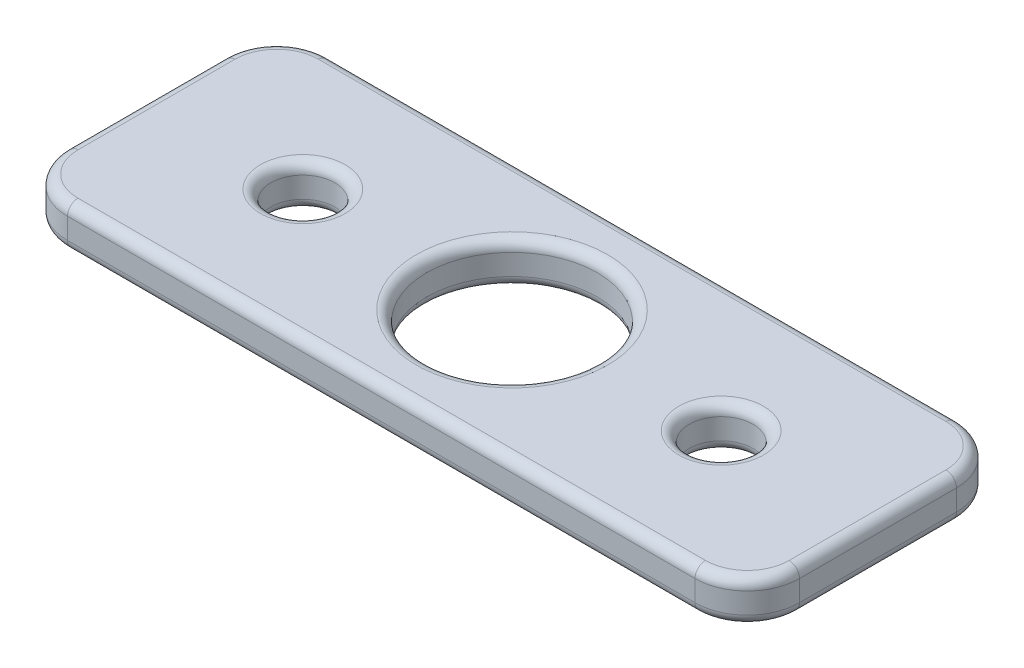
ISO-10303-21;
HEADER;
FILE_DESCRIPTION(('STEP AP214'),'2;1');
FILE_NAME('part.step','',(''),(''),'','','');
FILE_SCHEMA(('AUTOMOTIVE_DESIGN { 1 0 10303 214 1 1 1 1 }'));
ENDSEC;
DATA;
#1=APPLICATION_CONTEXT('core data for automotive mechanical design processes');
#2=APPLICATION_PROTOCOL_DEFINITION('international standard','automotive_design',2000,#1);
#3=PRODUCT_CONTEXT('',#1,'mechanical');
#4=PRODUCT('Part','Part','',(#3));
#5=PRODUCT_RELATED_PRODUCT_CATEGORY('part','',(#4));
#6=PRODUCT_DEFINITION_FORMATION('','',#4);
#7=PRODUCT_DEFINITION_CONTEXT('part definition',#1,'design');
#8=PRODUCT_DEFINITION('design','',#6,#7);
#9=PRODUCT_DEFINITION_SHAPE('','',#8);
#10=(LENGTH_UNIT() NAMED_UNIT(*) SI_UNIT(.MILLI.,.METRE.));
#11=(NAMED_UNIT(*) PLANE_ANGLE_UNIT() SI_UNIT($,.RADIAN.));
#12=(NAMED_UNIT(*) SI_UNIT($,.STERADIAN.) SOLID_ANGLE_UNIT());
#13=UNCERTAINTY_MEASURE_WITH_UNIT(LENGTH_MEASURE(1.E-05),#10,'distance_accuracy_value','');
#14=(GEOMETRIC_REPRESENTATION_CONTEXT(3) GLOBAL_UNCERTAINTY_ASSIGNED_CONTEXT((#13)) GLOBAL_UNIT_ASSIGNED_CONTEXT((#10,
#11,#12)) REPRESENTATION_CONTEXT('',''));
#15=CARTESIAN_POINT('',(0.,0.,0.));
#16=DIRECTION('',(0.,0.,1.));
#17=DIRECTION('',(1.,0.,0.));
#18=AXIS2_PLACEMENT_3D('',#15,#16,#17);
#19=CARTESIAN_POINT('',(0.,4.,0.));
#20=DIRECTION('',(0.,-1.,0.));
#21=DIRECTION('',(0.,0.,-1.));
#22=AXIS2_PLACEMENT_3D('',#19,#20,#21);
#23=PLANE('',#22);
#24=CARTESIAN_POINT('',(55.,4.,-12.5));
#25=DIRECTION('',(0.,-1.,0.));
#26=DIRECTION('',(0.,0.,-1.));
#27=AXIS2_PLACEMENT_3D('',#24,#25,#26);
#28=CIRCLE('',#27,4.05000000000001);
#29=CARTESIAN_POINT('',(55.,4.,-16.55));
#30=VERTEX_POINT('',#29);
#31=EDGE_CURVE('E11',#30,#30,#28,.T.);
#32=ORIENTED_EDGE('',*,*,#31,.T.);
#33=EDGE_LOOP('',(#32));
#34=FACE_BOUND('',#33,.T.);
#35=CARTESIAN_POINT('',(35.,4.,-12.5));
#36=DIRECTION('',(0.,-1.,0.));
#37=DIRECTION('',(0.,0.,-1.));
#38=AXIS2_PLACEMENT_3D('',#35,#36,#37);
#39=CIRCLE('',#38,9.15);
#40=CARTESIAN_POINT('',(35.,4.,-21.65));
#41=VERTEX_POINT('',#40);
#42=EDGE_CURVE('E48',#41,#41,#39,.T.);
#43=ORIENTED_EDGE('',*,*,#42,.T.);
#44=EDGE_LOOP('',(#43));
#45=FACE_BOUND('',#44,.T.);
#46=CARTESIAN_POINT('',(15.,4.,-12.5));
#47=DIRECTION('',(0.,-1.,0.));
#48=DIRECTION('',(0.,0.,-1.));
#49=AXIS2_PLACEMENT_3D('',#46,#47,#48);
#50=CIRCLE('',#49,4.05);
#51=CARTESIAN_POINT('',(15.,4.,-16.55));
#52=VERTEX_POINT('',#51);
#53=EDGE_CURVE('E292',#52,#52,#50,.T.);
#54=ORIENTED_EDGE('',*,*,#53,.T.);
#55=EDGE_LOOP('',(#54));
#56=FACE_BOUND('',#55,.T.);
#57=DIRECTION('',(1.,0.,0.));
#58=VECTOR('',#57,1.);
#59=CARTESIAN_POINT('',(0.,4.,-1.));
#60=LINE('',#59,#58);
#61=CARTESIAN_POINT('',(5.,4.,-1.));
#62=VERTEX_POINT('',#61);
#63=CARTESIAN_POINT('',(65.,4.,-1.));
#64=VERTEX_POINT('',#63);
#65=EDGE_CURVE('E56',#62,#64,#60,.T.);
#66=ORIENTED_EDGE('',*,*,#65,.T.);
#67=CARTESIAN_POINT('',(65.,4.,-5.));
#68=DIRECTION('',(0.,-1.,0.));
#69=DIRECTION('',(0.,0.,-1.));
#70=AXIS2_PLACEMENT_3D('',#67,#68,#69);
#71=CIRCLE('',#70,4.);
#72=CARTESIAN_POINT('',(69.,4.,-5.));
#73=VERTEX_POINT('',#72);
#74=EDGE_CURVE('E289',#64,#73,#71,.F.);
#75=ORIENTED_EDGE('',*,*,#74,.T.);
#76=DIRECTION('',(0.,0.,-1.));
#77=VECTOR('',#76,1.);
#78=CARTESIAN_POINT('',(69.,4.,0.));
#79=LINE('',#78,#77);
#80=CARTESIAN_POINT('',(69.,4.,-20.));
#81=VERTEX_POINT('',#80);
#82=EDGE_CURVE('E270',#73,#81,#79,.T.);
#83=ORIENTED_EDGE('',*,*,#82,.T.);
#84=CARTESIAN_POINT('',(65.,4.,-20.));
#85=DIRECTION('',(0.,-1.,0.));
#86=DIRECTION('',(0.,0.,-1.));
#87=AXIS2_PLACEMENT_3D('',#84,#85,#86);
#88=CIRCLE('',#87,4.);
#89=CARTESIAN_POINT('',(65.,4.,-24.));
#90=VERTEX_POINT('',#89);
#91=EDGE_CURVE('E273',#81,#90,#88,.F.);
#92=ORIENTED_EDGE('',*,*,#91,.T.);
#93=DIRECTION('',(-1.,0.,0.));
#94=VECTOR('',#93,1.);
#95=CARTESIAN_POINT('',(0.,4.,-24.));
#96=LINE('',#95,#94);
#97=CARTESIAN_POINT('',(5.,4.,-24.));
#98=VERTEX_POINT('',#97);
#99=EDGE_CURVE('E276',#90,#98,#96,.T.);
#100=ORIENTED_EDGE('',*,*,#99,.T.);
#101=CARTESIAN_POINT('',(5.,4.,-20.));
#102=DIRECTION('',(0.,-1.,0.));
#103=DIRECTION('',(0.,0.,-1.));
#104=AXIS2_PLACEMENT_3D('',#101,#102,#103);
#105=CIRCLE('',#104,4.);
#106=CARTESIAN_POINT('',(1.,4.,-20.));
#107=VERTEX_POINT('',#106);
#108=EDGE_CURVE('E279',#98,#107,#105,.F.);
#109=ORIENTED_EDGE('',*,*,#108,.T.);
#110=DIRECTION('',(0.,0.,1.));
#111=VECTOR('',#110,1.);
#112=CARTESIAN_POINT('',(1.,4.,0.));
#113=LINE('',#112,#111);
#114=CARTESIAN_POINT('',(1.,4.,-5.));
#115=VERTEX_POINT('',#114);
#116=EDGE_CURVE('E282',#107,#115,#113,.T.);
#117=ORIENTED_EDGE('',*,*,#116,.T.);
#118=CARTESIAN_POINT('',(5.,4.,-5.));
#119=DIRECTION('',(0.,-1.,0.));
#120=DIRECTION('',(0.,0.,-1.));
#121=AXIS2_PLACEMENT_3D('',#118,#119,#120);
#122=CIRCLE('',#121,4.);
#123=EDGE_CURVE('E61',#115,#62,#122,.F.);
#124=ORIENTED_EDGE('',*,*,#123,.T.);
#125=EDGE_LOOP('',(#66,#75,#83,#92,#100,#109,#117,#124));
#126=FACE_BOUND('',#125,.T.);
#127=ADVANCED_FACE('F38',(#34,#45,#56,#126),#23,.F.);
#128=CARTESIAN_POINT('',(0.,0.,0.));
#129=DIRECTION('',(0.,-1.,0.));
#130=DIRECTION('',(0.,0.,-1.));
#131=AXIS2_PLACEMENT_3D('',#128,#129,#130);
#132=PLANE('',#131);
#133=CARTESIAN_POINT('',(55.,0.,-12.5));
#134=DIRECTION('',(0.,-1.,0.));
#135=DIRECTION('',(0.,0.,-1.));
#136=AXIS2_PLACEMENT_3D('',#133,#134,#135);
#137=CIRCLE('',#136,4.05000000000001);
#138=CARTESIAN_POINT('',(55.,0.,-16.55));
#139=VERTEX_POINT('',#138);
#140=EDGE_CURVE('E189',#139,#139,#137,.F.);
#141=ORIENTED_EDGE('',*,*,#140,.T.);
#142=EDGE_LOOP('',(#141));
#143=FACE_BOUND('',#142,.T.);
#144=CARTESIAN_POINT('',(15.,0.,-12.5));
#145=DIRECTION('',(0.,-1.,0.));
#146=DIRECTION('',(0.,0.,-1.));
#147=AXIS2_PLACEMENT_3D('',#144,#145,#146);
#148=CIRCLE('',#147,4.05);
#149=CARTESIAN_POINT('',(15.,0.,-16.55));
#150=VERTEX_POINT('',#149);
#151=EDGE_CURVE('E184',#150,#150,#148,.F.);
#152=ORIENTED_EDGE('',*,*,#151,.T.);
#153=EDGE_LOOP('',(#152));
#154=FACE_BOUND('',#153,.T.);
#155=DIRECTION('',(0.,0.,1.));
#156=VECTOR('',#155,1.);
#157=CARTESIAN_POINT('',(1.,0.,-20.));
#158=LINE('',#157,#156);
#159=CARTESIAN_POINT('',(1.,0.,-5.));
#160=VERTEX_POINT('',#159);
#161=CARTESIAN_POINT('',(1.,0.,-20.));
#162=VERTEX_POINT('',#161);
#163=EDGE_CURVE('E181',#160,#162,#158,.F.);
#164=ORIENTED_EDGE('',*,*,#163,.T.);
#165=CARTESIAN_POINT('',(5.,0.,-20.));
#166=DIRECTION('',(0.,-1.,0.));
#167=DIRECTION('',(0.,0.,-1.));
#168=AXIS2_PLACEMENT_3D('',#165,#166,#167);
#169=CIRCLE('',#168,4.);
#170=CARTESIAN_POINT('',(5.,0.,-24.));
#171=VERTEX_POINT('',#170);
#172=EDGE_CURVE('E159',#162,#171,#169,.T.);
#173=ORIENTED_EDGE('',*,*,#172,.T.);
#174=DIRECTION('',(-1.,0.,0.));
#175=VECTOR('',#174,1.);
#176=CARTESIAN_POINT('',(65.,0.,-24.));
#177=LINE('',#176,#175);
#178=CARTESIAN_POINT('',(65.,0.,-24.));
#179=VERTEX_POINT('',#178);
#180=EDGE_CURVE('E168',#171,#179,#177,.F.);
#181=ORIENTED_EDGE('',*,*,#180,.T.);
#182=CARTESIAN_POINT('',(65.,0.,-20.));
#183=DIRECTION('',(0.,-1.,0.));
#184=DIRECTION('',(0.,0.,-1.));
#185=AXIS2_PLACEMENT_3D('',#182,#183,#184);
#186=CIRCLE('',#185,4.);
#187=CARTESIAN_POINT('',(69.,0.,-20.));
#188=VERTEX_POINT('',#187);
#189=EDGE_CURVE('E175',#179,#188,#186,.T.);
#190=ORIENTED_EDGE('',*,*,#189,.T.);
#191=DIRECTION('',(0.,0.,-1.));
#192=VECTOR('',#191,1.);
#193=CARTESIAN_POINT('',(69.,0.,-5.));
#194=LINE('',#193,#192);
#195=CARTESIAN_POINT('',(69.,0.,-5.));
#196=VERTEX_POINT('',#195);
#197=EDGE_CURVE('E407',#188,#196,#194,.F.);
#198=ORIENTED_EDGE('',*,*,#197,.T.);
#199=CARTESIAN_POINT('',(65.,0.,-5.));
#200=DIRECTION('',(0.,-1.,0.));
#201=DIRECTION('',(0.,0.,-1.));
#202=AXIS2_PLACEMENT_3D('',#199,#200,#201);
#203=CIRCLE('',#202,4.);
#204=CARTESIAN_POINT('',(65.,0.,-1.));
#205=VERTEX_POINT('',#204);
#206=EDGE_CURVE('E410',#196,#205,#203,.T.);
#207=ORIENTED_EDGE('',*,*,#206,.T.);
#208=DIRECTION('',(1.,0.,0.));
#209=VECTOR('',#208,1.);
#210=CARTESIAN_POINT('',(5.,0.,-1.));
#211=LINE('',#210,#209);
#212=CARTESIAN_POINT('',(5.,0.,-1.));
#213=VERTEX_POINT('',#212);
#214=EDGE_CURVE('E413',#205,#213,#211,.F.);
#215=ORIENTED_EDGE('',*,*,#214,.T.);
#216=CARTESIAN_POINT('',(5.,0.,-5.));
#217=DIRECTION('',(0.,-1.,0.));
#218=DIRECTION('',(0.,0.,-1.));
#219=AXIS2_PLACEMENT_3D('',#216,#217,#218);
#220=CIRCLE('',#219,4.);
#221=EDGE_CURVE('E191',#213,#160,#220,.T.);
#222=ORIENTED_EDGE('',*,*,#221,.T.);
#223=EDGE_LOOP('',(#164,#173,#181,#190,#198,#207,#215,#222));
#224=FACE_BOUND('',#223,.T.);
#225=CARTESIAN_POINT('',(35.,0.,-12.5));
#226=DIRECTION('',(0.,-1.,0.));
#227=DIRECTION('',(0.,0.,-1.));
#228=AXIS2_PLACEMENT_3D('',#225,#226,#227);
#229=CIRCLE('',#228,9.15);
#230=CARTESIAN_POINT('',(35.,0.,-21.65));
#231=VERTEX_POINT('',#230);
#232=EDGE_CURVE('E176',#231,#231,#229,.F.);
#233=ORIENTED_EDGE('',*,*,#232,.T.);
#234=EDGE_LOOP('',(#233));
#235=FACE_BOUND('',#234,.T.);
#236=ADVANCED_FACE('F178',(#143,#154,#224,#235),#132,.T.);
#237=CARTESIAN_POINT('',(0.,4.,0.));
#238=DIRECTION('',(1.,0.,0.));
#239=DIRECTION('',(0.,0.,-1.));
#240=AXIS2_PLACEMENT_3D('',#237,#238,#239);
#241=PLANE('',#240);
#242=DIRECTION('',(0.,-1.,0.));
#243=VECTOR('',#242,1.);
#244=CARTESIAN_POINT('',(0.,4.,-20.));
#245=LINE('',#244,#243);
#246=CARTESIAN_POINT('',(0.,3.,-20.));
#247=VERTEX_POINT('',#246);
#248=CARTESIAN_POINT('',(0.,1.,-20.));
#249=VERTEX_POINT('',#248);
#250=EDGE_CURVE('E369',#247,#249,#245,.T.);
#251=ORIENTED_EDGE('',*,*,#250,.T.);
#252=DIRECTION('',(0.,0.,1.));
#253=VECTOR('',#252,1.);
#254=CARTESIAN_POINT('',(0.,1.,-5.));
#255=LINE('',#254,#253);
#256=CARTESIAN_POINT('',(0.,1.,-5.));
#257=VERTEX_POINT('',#256);
#258=EDGE_CURVE('E222',#249,#257,#255,.T.);
#259=ORIENTED_EDGE('',*,*,#258,.T.);
#260=DIRECTION('',(0.,-1.,0.));
#261=VECTOR('',#260,1.);
#262=CARTESIAN_POINT('',(0.,4.,-5.));
#263=LINE('',#262,#261);
#264=CARTESIAN_POINT('',(0.,3.,-5.));
#265=VERTEX_POINT('',#264);
#266=EDGE_CURVE('E388',#257,#265,#263,.F.);
#267=ORIENTED_EDGE('',*,*,#266,.T.);
#268=DIRECTION('',(0.,0.,1.));
#269=VECTOR('',#268,1.);
#270=CARTESIAN_POINT('',(0.,3.,0.));
#271=LINE('',#270,#269);
#272=EDGE_CURVE('E219',#265,#247,#271,.F.);
#273=ORIENTED_EDGE('',*,*,#272,.T.);
#274=EDGE_LOOP('',(#251,#259,#267,#273));
#275=FACE_BOUND('',#274,.T.);
#276=ADVANCED_FACE('F428',(#275),#241,.F.);
#277=CARTESIAN_POINT('',(0.,4.,0.));
#278=DIRECTION('',(0.,0.,-1.));
#279=DIRECTION('',(-1.,0.,0.));
#280=AXIS2_PLACEMENT_3D('',#277,#278,#279);
#281=PLANE('',#280);
#282=DIRECTION('',(0.,-1.,0.));
#283=VECTOR('',#282,1.);
#284=CARTESIAN_POINT('',(5.,4.,0.));
#285=LINE('',#284,#283);
#286=CARTESIAN_POINT('',(5.,3.,0.));
#287=VERTEX_POINT('',#286);
#288=CARTESIAN_POINT('',(5.,1.,0.));
#289=VERTEX_POINT('',#288);
#290=EDGE_CURVE('E398',#287,#289,#285,.T.);
#291=ORIENTED_EDGE('',*,*,#290,.T.);
#292=DIRECTION('',(1.,0.,0.));
#293=VECTOR('',#292,1.);
#294=CARTESIAN_POINT('',(65.,1.,0.));
#295=LINE('',#294,#293);
#296=CARTESIAN_POINT('',(65.,1.,0.));
#297=VERTEX_POINT('',#296);
#298=EDGE_CURVE('E234',#289,#297,#295,.T.);
#299=ORIENTED_EDGE('',*,*,#298,.T.);
#300=DIRECTION('',(0.,-1.,0.));
#301=VECTOR('',#300,1.);
#302=CARTESIAN_POINT('',(65.,4.,0.));
#303=LINE('',#302,#301);
#304=CARTESIAN_POINT('',(65.,3.,0.));
#305=VERTEX_POINT('',#304);
#306=EDGE_CURVE('E394',#297,#305,#303,.F.);
#307=ORIENTED_EDGE('',*,*,#306,.T.);
#308=DIRECTION('',(1.,0.,0.));
#309=VECTOR('',#308,1.);
#310=CARTESIAN_POINT('',(0.,3.,0.));
#311=LINE('',#310,#309);
#312=EDGE_CURVE('E231',#305,#287,#311,.F.);
#313=ORIENTED_EDGE('',*,*,#312,.T.);
#314=EDGE_LOOP('',(#291,#299,#307,#313));
#315=FACE_BOUND('',#314,.T.);
#316=ADVANCED_FACE('F471',(#315),#281,.F.);
#317=CARTESIAN_POINT('',(70.,4.,0.));
#318=DIRECTION('',(-1.,0.,0.));
#319=DIRECTION('',(0.,0.,1.));
#320=AXIS2_PLACEMENT_3D('',#317,#318,#319);
#321=PLANE('',#320);
#322=DIRECTION('',(0.,-1.,0.));
#323=VECTOR('',#322,1.);
#324=CARTESIAN_POINT('',(70.,4.,-5.));
#325=LINE('',#324,#323);
#326=CARTESIAN_POINT('',(70.,3.,-5.));
#327=VERTEX_POINT('',#326);
#328=CARTESIAN_POINT('',(70.,1.,-5.));
#329=VERTEX_POINT('',#328);
#330=EDGE_CURVE('E378',#327,#329,#325,.T.);
#331=ORIENTED_EDGE('',*,*,#330,.T.);
#332=DIRECTION('',(0.,0.,-1.));
#333=VECTOR('',#332,1.);
#334=CARTESIAN_POINT('',(70.,1.,-20.));
#335=LINE('',#334,#333);
#336=CARTESIAN_POINT('',(70.,1.,-20.));
#337=VERTEX_POINT('',#336);
#338=EDGE_CURVE('E247',#329,#337,#335,.T.);
#339=ORIENTED_EDGE('',*,*,#338,.T.);
#340=DIRECTION('',(0.,-1.,0.));
#341=VECTOR('',#340,1.);
#342=CARTESIAN_POINT('',(70.,4.,-20.));
#343=LINE('',#342,#341);
#344=CARTESIAN_POINT('',(70.,3.,-20.));
#345=VERTEX_POINT('',#344);
#346=EDGE_CURVE('E384',#337,#345,#343,.F.);
#347=ORIENTED_EDGE('',*,*,#346,.T.);
#348=DIRECTION('',(0.,0.,-1.));
#349=VECTOR('',#348,1.);
#350=CARTESIAN_POINT('',(70.,3.,0.));
#351=LINE('',#350,#349);
#352=EDGE_CURVE('E244',#345,#327,#351,.F.);
#353=ORIENTED_EDGE('',*,*,#352,.T.);
#354=EDGE_LOOP('',(#331,#339,#347,#353));
#355=FACE_BOUND('',#354,.T.);
#356=ADVANCED_FACE('F455',(#355),#321,.F.);
#357=CARTESIAN_POINT('',(0.,4.,-25.));
#358=DIRECTION('',(0.,0.,1.));
#359=DIRECTION('',(1.,0.,0.));
#360=AXIS2_PLACEMENT_3D('',#357,#358,#359);
#361=PLANE('',#360);
#362=DIRECTION('',(0.,-1.,0.));
#363=VECTOR('',#362,1.);
#364=CARTESIAN_POINT('',(65.,4.,-25.));
#365=LINE('',#364,#363);
#366=CARTESIAN_POINT('',(65.,3.,-25.));
#367=VERTEX_POINT('',#366);
#368=CARTESIAN_POINT('',(65.,1.,-25.));
#369=VERTEX_POINT('',#368);
#370=EDGE_CURVE('E375',#367,#369,#365,.T.);
#371=ORIENTED_EDGE('',*,*,#370,.T.);
#372=DIRECTION('',(-1.,0.,0.));
#373=VECTOR('',#372,1.);
#374=CARTESIAN_POINT('',(5.,1.,-25.));
#375=LINE('',#374,#373);
#376=CARTESIAN_POINT('',(5.,1.,-25.));
#377=VERTEX_POINT('',#376);
#378=EDGE_CURVE('E259',#369,#377,#375,.T.);
#379=ORIENTED_EDGE('',*,*,#378,.T.);
#380=DIRECTION('',(0.,-1.,0.));
#381=VECTOR('',#380,1.);
#382=CARTESIAN_POINT('',(5.,4.,-25.));
#383=LINE('',#382,#381);
#384=CARTESIAN_POINT('',(5.,3.,-25.));
#385=VERTEX_POINT('',#384);
#386=EDGE_CURVE('E323',#377,#385,#383,.F.);
#387=ORIENTED_EDGE('',*,*,#386,.T.);
#388=DIRECTION('',(-1.,0.,0.));
#389=VECTOR('',#388,1.);
#390=CARTESIAN_POINT('',(0.,3.,-25.));
#391=LINE('',#390,#389);
#392=EDGE_CURVE('E256',#385,#367,#391,.F.);
#393=ORIENTED_EDGE('',*,*,#392,.T.);
#394=EDGE_LOOP('',(#371,#379,#387,#393));
#395=FACE_BOUND('',#394,.T.);
#396=ADVANCED_FACE('F372',(#395),#361,.F.);
#397=CARTESIAN_POINT('',(15.,4.,-12.5));
#398=DIRECTION('',(0.,-1.,0.));
#399=DIRECTION('',(0.,0.,-1.));
#400=AXIS2_PLACEMENT_3D('',#397,#398,#399);
#401=CYLINDRICAL_SURFACE('',#400,3.05);
#402=CARTESIAN_POINT('',(15.,1.,-12.5));
#403=DIRECTION('',(0.,-1.,0.));
#404=DIRECTION('',(0.,0.,-1.));
#405=AXIS2_PLACEMENT_3D('',#402,#403,#404);
#406=CIRCLE('',#405,3.05);
#407=CARTESIAN_POINT('',(15.,1.,-15.55));
#408=VERTEX_POINT('',#407);
#409=EDGE_CURVE('E210',#408,#408,#406,.T.);
#410=ORIENTED_EDGE('',*,*,#409,.T.);
#411=EDGE_LOOP('',(#410));
#412=FACE_BOUND('',#411,.T.);
#413=CARTESIAN_POINT('',(15.,3.,-12.5));
#414=DIRECTION('',(0.,-1.,0.));
#415=DIRECTION('',(0.,0.,-1.));
#416=AXIS2_PLACEMENT_3D('',#413,#414,#415);
#417=CIRCLE('',#416,3.05);
#418=CARTESIAN_POINT('',(15.,3.,-15.55));
#419=VERTEX_POINT('',#418);
#420=EDGE_CURVE('E206',#419,#419,#417,.F.);
#421=ORIENTED_EDGE('',*,*,#420,.T.);
#422=EDGE_LOOP('',(#421));
#423=FACE_BOUND('',#422,.T.);
#424=ADVANCED_FACE('F490',(#412,#423),#401,.F.);
#425=CARTESIAN_POINT('',(35.,4.,-12.5));
#426=DIRECTION('',(0.,-1.,0.));
#427=DIRECTION('',(0.,0.,-1.));
#428=AXIS2_PLACEMENT_3D('',#425,#426,#427);
#429=CYLINDRICAL_SURFACE('',#428,8.15);
#430=CARTESIAN_POINT('',(35.,1.,-12.5));
#431=DIRECTION('',(0.,-1.,0.));
#432=DIRECTION('',(0.,0.,-1.));
#433=AXIS2_PLACEMENT_3D('',#430,#431,#432);
#434=CIRCLE('',#433,8.15);
#435=CARTESIAN_POINT('',(35.,1.,-20.65));
#436=VERTEX_POINT('',#435);
#437=EDGE_CURVE('E266',#436,#436,#434,.T.);
#438=ORIENTED_EDGE('',*,*,#437,.T.);
#439=EDGE_LOOP('',(#438));
#440=FACE_BOUND('',#439,.T.);
#441=CARTESIAN_POINT('',(35.,3.,-12.5));
#442=DIRECTION('',(0.,-1.,0.));
#443=DIRECTION('',(0.,0.,-1.));
#444=AXIS2_PLACEMENT_3D('',#441,#442,#443);
#445=CIRCLE('',#444,8.15);
#446=CARTESIAN_POINT('',(35.,3.,-20.65));
#447=VERTEX_POINT('',#446);
#448=EDGE_CURVE('E262',#447,#447,#445,.F.);
#449=ORIENTED_EDGE('',*,*,#448,.T.);
#450=EDGE_LOOP('',(#449));
#451=FACE_BOUND('',#450,.T.);
#452=ADVANCED_FACE('F497',(#440,#451),#429,.F.);
#453=CARTESIAN_POINT('',(55.,4.,-12.5));
#454=DIRECTION('',(0.,-1.,0.));
#455=DIRECTION('',(0.,0.,-1.));
#456=AXIS2_PLACEMENT_3D('',#453,#454,#455);
#457=CYLINDRICAL_SURFACE('',#456,3.05000000000001);
#458=CARTESIAN_POINT('',(55.,1.,-12.5));
#459=DIRECTION('',(0.,-1.,0.));
#460=DIRECTION('',(0.,0.,-1.));
#461=AXIS2_PLACEMENT_3D('',#458,#459,#460);
#462=CIRCLE('',#461,3.05000000000001);
#463=CARTESIAN_POINT('',(55.,1.,-15.55));
#464=VERTEX_POINT('',#463);
#465=EDGE_CURVE('E202',#464,#464,#462,.T.);
#466=ORIENTED_EDGE('',*,*,#465,.T.);
#467=EDGE_LOOP('',(#466));
#468=FACE_BOUND('',#467,.T.);
#469=CARTESIAN_POINT('',(55.,3.,-12.5));
#470=DIRECTION('',(0.,-1.,0.));
#471=DIRECTION('',(0.,0.,-1.));
#472=AXIS2_PLACEMENT_3D('',#469,#470,#471);
#473=CIRCLE('',#472,3.05000000000001);
#474=CARTESIAN_POINT('',(55.,3.,-15.55));
#475=VERTEX_POINT('',#474);
#476=EDGE_CURVE('E198',#475,#475,#473,.F.);
#477=ORIENTED_EDGE('',*,*,#476,.T.);
#478=EDGE_LOOP('',(#477));
#479=FACE_BOUND('',#478,.T.);
#480=ADVANCED_FACE('F502',(#468,#479),#457,.F.);
#481=CARTESIAN_POINT('',(65.,4.,-20.));
#482=DIRECTION('',(0.,-1.,0.));
#483=DIRECTION('',(0.,0.,-1.));
#484=AXIS2_PLACEMENT_3D('',#481,#482,#483);
#485=CYLINDRICAL_SURFACE('',#484,5.);
#486=ORIENTED_EDGE('',*,*,#346,.F.);
#487=CARTESIAN_POINT('',(65.,1.,-20.));
#488=DIRECTION('',(0.,-1.,0.));
#489=DIRECTION('',(0.,0.,-1.));
#490=AXIS2_PLACEMENT_3D('',#487,#488,#489);
#491=CIRCLE('',#490,5.);
#492=EDGE_CURVE('E253',#337,#369,#491,.F.);
#493=ORIENTED_EDGE('',*,*,#492,.T.);
#494=ORIENTED_EDGE('',*,*,#370,.F.);
#495=CARTESIAN_POINT('',(65.,3.,-20.));
#496=DIRECTION('',(0.,-1.,0.));
#497=DIRECTION('',(0.,0.,-1.));
#498=AXIS2_PLACEMENT_3D('',#495,#496,#497);
#499=CIRCLE('',#498,5.);
#500=EDGE_CURVE('E250',#367,#345,#499,.T.);
#501=ORIENTED_EDGE('',*,*,#500,.T.);
#502=EDGE_LOOP('',(#486,#493,#494,#501));
#503=FACE_BOUND('',#502,.T.);
#504=ADVANCED_FACE('F707',(#503),#485,.T.);
#505=CARTESIAN_POINT('',(5.,4.,-20.));
#506=DIRECTION('',(0.,-1.,0.));
#507=DIRECTION('',(0.,0.,-1.));
#508=AXIS2_PLACEMENT_3D('',#505,#506,#507);
#509=CYLINDRICAL_SURFACE('',#508,5.);
#510=ORIENTED_EDGE('',*,*,#386,.F.);
#511=CARTESIAN_POINT('',(5.,1.,-20.));
#512=DIRECTION('',(0.,-1.,0.));
#513=DIRECTION('',(0.,0.,-1.));
#514=AXIS2_PLACEMENT_3D('',#511,#512,#513);
#515=CIRCLE('',#514,5.);
#516=EDGE_CURVE('E161',#377,#249,#515,.F.);
#517=ORIENTED_EDGE('',*,*,#516,.T.);
#518=ORIENTED_EDGE('',*,*,#250,.F.);
#519=CARTESIAN_POINT('',(5.,3.,-20.));
#520=DIRECTION('',(0.,-1.,0.));
#521=DIRECTION('',(0.,0.,-1.));
#522=AXIS2_PLACEMENT_3D('',#519,#520,#521);
#523=CIRCLE('',#522,5.);
#524=EDGE_CURVE('E214',#247,#385,#523,.T.);
#525=ORIENTED_EDGE('',*,*,#524,.T.);
#526=EDGE_LOOP('',(#510,#517,#518,#525));
#527=FACE_BOUND('',#526,.T.);
#528=ADVANCED_FACE('F367',(#527),#509,.T.);
#529=CARTESIAN_POINT('',(5.,4.,-5.));
#530=DIRECTION('',(0.,-1.,0.));
#531=DIRECTION('',(0.,0.,-1.));
#532=AXIS2_PLACEMENT_3D('',#529,#530,#531);
#533=CYLINDRICAL_SURFACE('',#532,5.);
#534=ORIENTED_EDGE('',*,*,#266,.F.);
#535=CARTESIAN_POINT('',(5.,1.,-5.));
#536=DIRECTION('',(0.,-1.,0.));
#537=DIRECTION('',(0.,0.,-1.));
#538=AXIS2_PLACEMENT_3D('',#535,#536,#537);
#539=CIRCLE('',#538,5.);
#540=EDGE_CURVE('E228',#257,#289,#539,.F.);
#541=ORIENTED_EDGE('',*,*,#540,.T.);
#542=ORIENTED_EDGE('',*,*,#290,.F.);
#543=CARTESIAN_POINT('',(5.,3.,-5.));
#544=DIRECTION('',(0.,-1.,0.));
#545=DIRECTION('',(0.,0.,-1.));
#546=AXIS2_PLACEMENT_3D('',#543,#544,#545);
#547=CIRCLE('',#546,5.);
#548=EDGE_CURVE('E225',#287,#265,#547,.T.);
#549=ORIENTED_EDGE('',*,*,#548,.T.);
#550=EDGE_LOOP('',(#534,#541,#542,#549));
#551=FACE_BOUND('',#550,.T.);
#552=ADVANCED_FACE('F430',(#551),#533,.T.);
#553=CARTESIAN_POINT('',(65.,4.,-5.));
#554=DIRECTION('',(0.,-1.,0.));
#555=DIRECTION('',(0.,0.,-1.));
#556=AXIS2_PLACEMENT_3D('',#553,#554,#555);
#557=CYLINDRICAL_SURFACE('',#556,5.);
#558=ORIENTED_EDGE('',*,*,#306,.F.);
#559=CARTESIAN_POINT('',(65.,1.,-5.));
#560=DIRECTION('',(0.,-1.,0.));
#561=DIRECTION('',(0.,0.,-1.));
#562=AXIS2_PLACEMENT_3D('',#559,#560,#561);
#563=CIRCLE('',#562,5.);
#564=EDGE_CURVE('E241',#297,#329,#563,.F.);
#565=ORIENTED_EDGE('',*,*,#564,.T.);
#566=ORIENTED_EDGE('',*,*,#330,.F.);
#567=CARTESIAN_POINT('',(65.,3.,-5.));
#568=DIRECTION('',(0.,-1.,0.));
#569=DIRECTION('',(0.,0.,-1.));
#570=AXIS2_PLACEMENT_3D('',#567,#568,#569);
#571=CIRCLE('',#570,5.);
#572=EDGE_CURVE('E237',#327,#305,#571,.T.);
#573=ORIENTED_EDGE('',*,*,#572,.T.);
#574=EDGE_LOOP('',(#558,#565,#566,#573));
#575=FACE_BOUND('',#574,.T.);
#576=ADVANCED_FACE('F460',(#575),#557,.T.);
#577=CARTESIAN_POINT('',(55.,1.,-12.5));
#578=DIRECTION('',(0.,-1.,0.));
#579=DIRECTION('',(0.,0.,-1.));
#580=AXIS2_PLACEMENT_3D('',#577,#578,#579);
#581=TOROIDAL_SURFACE('',#580,4.05000000000001,1.);
#582=ORIENTED_EDGE('',*,*,#465,.F.);
#583=EDGE_LOOP('',(#582));
#584=FACE_BOUND('',#583,.T.);
#585=ORIENTED_EDGE('',*,*,#140,.F.);
#586=EDGE_LOOP('',(#585));
#587=FACE_BOUND('',#586,.T.);
#588=ADVANCED_FACE('F676',(#584,#587),#581,.T.);
#589=CARTESIAN_POINT('',(15.,1.,-12.5));
#590=DIRECTION('',(0.,-1.,0.));
#591=DIRECTION('',(0.,0.,-1.));
#592=AXIS2_PLACEMENT_3D('',#589,#590,#591);
#593=TOROIDAL_SURFACE('',#592,4.05,1.);
#594=ORIENTED_EDGE('',*,*,#409,.F.);
#595=EDGE_LOOP('',(#594));
#596=FACE_BOUND('',#595,.T.);
#597=ORIENTED_EDGE('',*,*,#151,.F.);
#598=EDGE_LOOP('',(#597));
#599=FACE_BOUND('',#598,.T.);
#600=ADVANCED_FACE('F668',(#596,#599),#593,.T.);
#601=CARTESIAN_POINT('',(65.,1.,-5.));
#602=DIRECTION('',(0.,-1.,0.));
#603=DIRECTION('',(0.,0.,-1.));
#604=AXIS2_PLACEMENT_3D('',#601,#602,#603);
#605=TOROIDAL_SURFACE('',#604,4.,1.);
#606=CARTESIAN_POINT('',(69.,1.,-5.));
#607=DIRECTION('',(0.,0.,-1.));
#608=DIRECTION('',(-1.,0.,0.));
#609=AXIS2_PLACEMENT_3D('',#606,#607,#608);
#610=CIRCLE('',#609,1.);
#611=EDGE_CURVE('E315',#329,#196,#610,.T.);
#612=ORIENTED_EDGE('',*,*,#611,.F.);
#613=ORIENTED_EDGE('',*,*,#564,.F.);
#614=CARTESIAN_POINT('',(65.,1.,-1.));
#615=DIRECTION('',(-1.,0.,0.));
#616=DIRECTION('',(0.,0.,1.));
#617=AXIS2_PLACEMENT_3D('',#614,#615,#616);
#618=CIRCLE('',#617,1.);
#619=EDGE_CURVE('E319',#205,#297,#618,.T.);
#620=ORIENTED_EDGE('',*,*,#619,.F.);
#621=ORIENTED_EDGE('',*,*,#206,.F.);
#622=EDGE_LOOP('',(#612,#613,#620,#621));
#623=FACE_BOUND('',#622,.T.);
#624=ADVANCED_FACE('F464',(#623),#605,.T.);
#625=CARTESIAN_POINT('',(0.,1.,-1.));
#626=DIRECTION('',(-1.,0.,0.));
#627=DIRECTION('',(0.,0.,1.));
#628=AXIS2_PLACEMENT_3D('',#625,#626,#627);
#629=CYLINDRICAL_SURFACE('',#628,1.);
#630=ORIENTED_EDGE('',*,*,#619,.T.);
#631=ORIENTED_EDGE('',*,*,#298,.F.);
#632=CARTESIAN_POINT('',(5.,1.,-1.));
#633=DIRECTION('',(-1.,0.,0.));
#634=DIRECTION('',(0.,0.,1.));
#635=AXIS2_PLACEMENT_3D('',#632,#633,#634);
#636=CIRCLE('',#635,1.);
#637=EDGE_CURVE('E311',#213,#289,#636,.T.);
#638=ORIENTED_EDGE('',*,*,#637,.F.);
#639=ORIENTED_EDGE('',*,*,#214,.F.);
#640=EDGE_LOOP('',(#630,#631,#638,#639));
#641=FACE_BOUND('',#640,.T.);
#642=ADVANCED_FACE('F469',(#641),#629,.T.);
#643=CARTESIAN_POINT('',(69.,1.,0.));
#644=DIRECTION('',(0.,0.,1.));
#645=DIRECTION('',(1.,0.,0.));
#646=AXIS2_PLACEMENT_3D('',#643,#644,#645);
#647=CYLINDRICAL_SURFACE('',#646,1.);
#648=ORIENTED_EDGE('',*,*,#611,.T.);
#649=ORIENTED_EDGE('',*,*,#197,.F.);
#650=CARTESIAN_POINT('',(69.,1.,-20.));
#651=DIRECTION('',(0.,0.,-1.));
#652=DIRECTION('',(-1.,0.,0.));
#653=AXIS2_PLACEMENT_3D('',#650,#651,#652);
#654=CIRCLE('',#653,1.);
#655=EDGE_CURVE('E307',#337,#188,#654,.T.);
#656=ORIENTED_EDGE('',*,*,#655,.F.);
#657=ORIENTED_EDGE('',*,*,#338,.F.);
#658=EDGE_LOOP('',(#648,#649,#656,#657));
#659=FACE_BOUND('',#658,.T.);
#660=ADVANCED_FACE('F645',(#659),#647,.T.);
#661=CARTESIAN_POINT('',(5.,1.,-5.));
#662=DIRECTION('',(0.,-1.,0.));
#663=DIRECTION('',(0.,0.,-1.));
#664=AXIS2_PLACEMENT_3D('',#661,#662,#663);
#665=TOROIDAL_SURFACE('',#664,4.,1.);
#666=ORIENTED_EDGE('',*,*,#637,.T.);
#667=ORIENTED_EDGE('',*,*,#540,.F.);
#668=CARTESIAN_POINT('',(1.,1.,-5.));
#669=DIRECTION('',(0.,0.,-1.));
#670=DIRECTION('',(-1.,0.,0.));
#671=AXIS2_PLACEMENT_3D('',#668,#669,#670);
#672=CIRCLE('',#671,1.);
#673=EDGE_CURVE('E303',#160,#257,#672,.T.);
#674=ORIENTED_EDGE('',*,*,#673,.F.);
#675=ORIENTED_EDGE('',*,*,#221,.F.);
#676=EDGE_LOOP('',(#666,#667,#674,#675));
#677=FACE_BOUND('',#676,.T.);
#678=ADVANCED_FACE('F422',(#677),#665,.T.);
#679=CARTESIAN_POINT('',(65.,1.,-20.));
#680=DIRECTION('',(0.,-1.,0.));
#681=DIRECTION('',(0.,0.,-1.));
#682=AXIS2_PLACEMENT_3D('',#679,#680,#681);
#683=TOROIDAL_SURFACE('',#682,4.,1.);
#684=ORIENTED_EDGE('',*,*,#655,.T.);
#685=ORIENTED_EDGE('',*,*,#189,.F.);
#686=CARTESIAN_POINT('',(65.,1.,-24.));
#687=DIRECTION('',(-1.,0.,0.));
#688=DIRECTION('',(0.,0.,1.));
#689=AXIS2_PLACEMENT_3D('',#686,#687,#688);
#690=CIRCLE('',#689,1.);
#691=EDGE_CURVE('E171',#369,#179,#690,.T.);
#692=ORIENTED_EDGE('',*,*,#691,.F.);
#693=ORIENTED_EDGE('',*,*,#492,.F.);
#694=EDGE_LOOP('',(#684,#685,#692,#693));
#695=FACE_BOUND('',#694,.T.);
#696=ADVANCED_FACE('F629',(#695),#683,.T.);
#697=CARTESIAN_POINT('',(1.,1.,0.));
#698=DIRECTION('',(0.,0.,-1.));
#699=DIRECTION('',(-1.,0.,0.));
#700=AXIS2_PLACEMENT_3D('',#697,#698,#699);
#701=CYLINDRICAL_SURFACE('',#700,1.);
#702=ORIENTED_EDGE('',*,*,#673,.T.);
#703=ORIENTED_EDGE('',*,*,#258,.F.);
#704=CARTESIAN_POINT('',(1.,1.,-20.));
#705=DIRECTION('',(0.,0.,-1.));
#706=DIRECTION('',(-1.,0.,0.));
#707=AXIS2_PLACEMENT_3D('',#704,#705,#706);
#708=CIRCLE('',#707,1.);
#709=EDGE_CURVE('E165',#162,#249,#708,.T.);
#710=ORIENTED_EDGE('',*,*,#709,.F.);
#711=ORIENTED_EDGE('',*,*,#163,.F.);
#712=EDGE_LOOP('',(#702,#703,#710,#711));
#713=FACE_BOUND('',#712,.T.);
#714=ADVANCED_FACE('F425',(#713),#701,.T.);
#715=CARTESIAN_POINT('',(0.,1.,-24.));
#716=DIRECTION('',(1.,0.,0.));
#717=DIRECTION('',(0.,0.,-1.));
#718=AXIS2_PLACEMENT_3D('',#715,#716,#717);
#719=CYLINDRICAL_SURFACE('',#718,1.);
#720=ORIENTED_EDGE('',*,*,#691,.T.);
#721=ORIENTED_EDGE('',*,*,#180,.F.);
#722=CARTESIAN_POINT('',(5.,1.,-24.));
#723=DIRECTION('',(-1.,0.,0.));
#724=DIRECTION('',(0.,0.,1.));
#725=AXIS2_PLACEMENT_3D('',#722,#723,#724);
#726=CIRCLE('',#725,1.);
#727=EDGE_CURVE('E155',#377,#171,#726,.T.);
#728=ORIENTED_EDGE('',*,*,#727,.F.);
#729=ORIENTED_EDGE('',*,*,#378,.F.);
#730=EDGE_LOOP('',(#720,#721,#728,#729));
#731=FACE_BOUND('',#730,.T.);
#732=ADVANCED_FACE('F169',(#731),#719,.T.);
#733=CARTESIAN_POINT('',(5.,1.,-20.));
#734=DIRECTION('',(0.,-1.,0.));
#735=DIRECTION('',(0.,0.,-1.));
#736=AXIS2_PLACEMENT_3D('',#733,#734,#735);
#737=TOROIDAL_SURFACE('',#736,4.,1.);
#738=ORIENTED_EDGE('',*,*,#709,.T.);
#739=ORIENTED_EDGE('',*,*,#516,.F.);
#740=ORIENTED_EDGE('',*,*,#727,.T.);
#741=ORIENTED_EDGE('',*,*,#172,.F.);
#742=EDGE_LOOP('',(#738,#739,#740,#741));
#743=FACE_BOUND('',#742,.T.);
#744=ADVANCED_FACE('F157',(#743),#737,.T.);
#745=CARTESIAN_POINT('',(35.,1.,-12.5));
#746=DIRECTION('',(0.,-1.,0.));
#747=DIRECTION('',(0.,0.,-1.));
#748=AXIS2_PLACEMENT_3D('',#745,#746,#747);
#749=TOROIDAL_SURFACE('',#748,9.15,1.);
#750=ORIENTED_EDGE('',*,*,#437,.F.);
#751=EDGE_LOOP('',(#750));
#752=FACE_BOUND('',#751,.T.);
#753=ORIENTED_EDGE('',*,*,#232,.F.);
#754=EDGE_LOOP('',(#753));
#755=FACE_BOUND('',#754,.T.);
#756=ADVANCED_FACE('F599',(#752,#755),#749,.T.);
#757=CARTESIAN_POINT('',(55.,3.,-12.5));
#758=DIRECTION('',(0.,-1.,0.));
#759=DIRECTION('',(0.,0.,-1.));
#760=AXIS2_PLACEMENT_3D('',#757,#758,#759);
#761=TOROIDAL_SURFACE('',#760,4.05000000000001,1.);
#762=ORIENTED_EDGE('',*,*,#31,.F.);
#763=EDGE_LOOP('',(#762));
#764=FACE_BOUND('',#763,.T.);
#765=ORIENTED_EDGE('',*,*,#476,.F.);
#766=EDGE_LOOP('',(#765));
#767=FACE_BOUND('',#766,.T.);
#768=ADVANCED_FACE('F517',(#764,#767),#761,.T.);
#769=CARTESIAN_POINT('',(35.,3.,-12.5));
#770=DIRECTION('',(0.,-1.,0.));
#771=DIRECTION('',(0.,0.,-1.));
#772=AXIS2_PLACEMENT_3D('',#769,#770,#771);
#773=TOROIDAL_SURFACE('',#772,9.15,1.);
#774=ORIENTED_EDGE('',*,*,#42,.F.);
#775=EDGE_LOOP('',(#774));
#776=FACE_BOUND('',#775,.T.);
#777=ORIENTED_EDGE('',*,*,#448,.F.);
#778=EDGE_LOOP('',(#777));
#779=FACE_BOUND('',#778,.T.);
#780=ADVANCED_FACE('F510',(#776,#779),#773,.T.);
#781=CARTESIAN_POINT('',(15.,3.,-12.5));
#782=DIRECTION('',(0.,-1.,0.));
#783=DIRECTION('',(0.,0.,-1.));
#784=AXIS2_PLACEMENT_3D('',#781,#782,#783);
#785=TOROIDAL_SURFACE('',#784,4.05,1.);
#786=ORIENTED_EDGE('',*,*,#53,.F.);
#787=EDGE_LOOP('',(#786));
#788=FACE_BOUND('',#787,.T.);
#789=ORIENTED_EDGE('',*,*,#420,.F.);
#790=EDGE_LOOP('',(#789));
#791=FACE_BOUND('',#790,.T.);
#792=ADVANCED_FACE('F508',(#788,#791),#785,.T.);
#793=CARTESIAN_POINT('',(5.,3.,-20.));
#794=DIRECTION('',(0.,-1.,0.));
#795=DIRECTION('',(0.,0.,-1.));
#796=AXIS2_PLACEMENT_3D('',#793,#794,#795);
#797=TOROIDAL_SURFACE('',#796,4.,1.);
#798=CARTESIAN_POINT('',(5.,3.,-24.));
#799=DIRECTION('',(1.,0.,0.));
#800=DIRECTION('',(0.,0.,-1.));
#801=AXIS2_PLACEMENT_3D('',#798,#799,#800);
#802=CIRCLE('',#801,1.);
#803=EDGE_CURVE('E345',#385,#98,#802,.T.);
#804=ORIENTED_EDGE('',*,*,#803,.F.);
#805=ORIENTED_EDGE('',*,*,#524,.F.);
#806=CARTESIAN_POINT('',(1.,3.,-20.));
#807=DIRECTION('',(0.,0.,1.));
#808=DIRECTION('',(1.,0.,0.));
#809=AXIS2_PLACEMENT_3D('',#806,#807,#808);
#810=CIRCLE('',#809,1.);
#811=EDGE_CURVE('E42',#107,#247,#810,.T.);
#812=ORIENTED_EDGE('',*,*,#811,.F.);
#813=ORIENTED_EDGE('',*,*,#108,.F.);
#814=EDGE_LOOP('',(#804,#805,#812,#813));
#815=FACE_BOUND('',#814,.T.);
#816=ADVANCED_FACE('F40',(#815),#797,.T.);
#817=CARTESIAN_POINT('',(1.,3.,0.));
#818=DIRECTION('',(0.,0.,1.));
#819=DIRECTION('',(1.,0.,0.));
#820=AXIS2_PLACEMENT_3D('',#817,#818,#819);
#821=CYLINDRICAL_SURFACE('',#820,1.);
#822=ORIENTED_EDGE('',*,*,#811,.T.);
#823=ORIENTED_EDGE('',*,*,#272,.F.);
#824=CARTESIAN_POINT('',(1.,3.,-5.));
#825=DIRECTION('',(0.,0.,1.));
#826=DIRECTION('',(1.,0.,0.));
#827=AXIS2_PLACEMENT_3D('',#824,#825,#826);
#828=CIRCLE('',#827,1.);
#829=EDGE_CURVE('E342',#115,#265,#828,.T.);
#830=ORIENTED_EDGE('',*,*,#829,.F.);
#831=ORIENTED_EDGE('',*,*,#116,.F.);
#832=EDGE_LOOP('',(#822,#823,#830,#831));
#833=FACE_BOUND('',#832,.T.);
#834=ADVANCED_FACE('F358',(#833),#821,.T.);
#835=CARTESIAN_POINT('',(0.,3.,-24.));
#836=DIRECTION('',(-1.,0.,0.));
#837=DIRECTION('',(0.,0.,1.));
#838=AXIS2_PLACEMENT_3D('',#835,#836,#837);
#839=CYLINDRICAL_SURFACE('',#838,1.);
#840=ORIENTED_EDGE('',*,*,#803,.T.);
#841=ORIENTED_EDGE('',*,*,#99,.F.);
#842=CARTESIAN_POINT('',(65.,3.,-24.));
#843=DIRECTION('',(1.,0.,0.));
#844=DIRECTION('',(0.,0.,-1.));
#845=AXIS2_PLACEMENT_3D('',#842,#843,#844);
#846=CIRCLE('',#845,1.);
#847=EDGE_CURVE('E338',#367,#90,#846,.T.);
#848=ORIENTED_EDGE('',*,*,#847,.F.);
#849=ORIENTED_EDGE('',*,*,#392,.F.);
#850=EDGE_LOOP('',(#840,#841,#848,#849));
#851=FACE_BOUND('',#850,.T.);
#852=ADVANCED_FACE('F533',(#851),#839,.T.);
#853=CARTESIAN_POINT('',(5.,3.,-5.));
#854=DIRECTION('',(0.,-1.,0.));
#855=DIRECTION('',(0.,0.,-1.));
#856=AXIS2_PLACEMENT_3D('',#853,#854,#855);
#857=TOROIDAL_SURFACE('',#856,4.,1.);
#858=ORIENTED_EDGE('',*,*,#829,.T.);
#859=ORIENTED_EDGE('',*,*,#548,.F.);
#860=CARTESIAN_POINT('',(5.,3.,-1.));
#861=DIRECTION('',(1.,0.,0.));
#862=DIRECTION('',(0.,0.,-1.));
#863=AXIS2_PLACEMENT_3D('',#860,#861,#862);
#864=CIRCLE('',#863,1.);
#865=EDGE_CURVE('E334',#62,#287,#864,.T.);
#866=ORIENTED_EDGE('',*,*,#865,.F.);
#867=ORIENTED_EDGE('',*,*,#123,.F.);
#868=EDGE_LOOP('',(#858,#859,#866,#867));
#869=FACE_BOUND('',#868,.T.);
#870=ADVANCED_FACE('F434',(#869),#857,.T.);
#871=CARTESIAN_POINT('',(65.,3.,-20.));
#872=DIRECTION('',(0.,-1.,0.));
#873=DIRECTION('',(0.,0.,-1.));
#874=AXIS2_PLACEMENT_3D('',#871,#872,#873);
#875=TOROIDAL_SURFACE('',#874,4.,1.);
#876=ORIENTED_EDGE('',*,*,#847,.T.);
#877=ORIENTED_EDGE('',*,*,#91,.F.);
#878=CARTESIAN_POINT('',(69.,3.,-20.));
#879=DIRECTION('',(0.,0.,1.));
#880=DIRECTION('',(1.,0.,0.));
#881=AXIS2_PLACEMENT_3D('',#878,#879,#880);
#882=CIRCLE('',#881,1.);
#883=EDGE_CURVE('E330',#345,#81,#882,.T.);
#884=ORIENTED_EDGE('',*,*,#883,.F.);
#885=ORIENTED_EDGE('',*,*,#500,.F.);
#886=EDGE_LOOP('',(#876,#877,#884,#885));
#887=FACE_BOUND('',#886,.T.);
#888=ADVANCED_FACE('F448',(#887),#875,.T.);
#889=CARTESIAN_POINT('',(0.,3.,-1.));
#890=DIRECTION('',(1.,0.,0.));
#891=DIRECTION('',(0.,0.,-1.));
#892=AXIS2_PLACEMENT_3D('',#889,#890,#891);
#893=CYLINDRICAL_SURFACE('',#892,1.);
#894=ORIENTED_EDGE('',*,*,#865,.T.);
#895=ORIENTED_EDGE('',*,*,#312,.F.);
#896=CARTESIAN_POINT('',(65.,3.,-1.));
#897=DIRECTION('',(1.,0.,0.));
#898=DIRECTION('',(0.,0.,-1.));
#899=AXIS2_PLACEMENT_3D('',#896,#897,#898);
#900=CIRCLE('',#899,1.);
#901=EDGE_CURVE('E327',#64,#305,#900,.T.);
#902=ORIENTED_EDGE('',*,*,#901,.F.);
#903=ORIENTED_EDGE('',*,*,#65,.F.);
#904=EDGE_LOOP('',(#894,#895,#902,#903));
#905=FACE_BOUND('',#904,.T.);
#906=ADVANCED_FACE('F437',(#905),#893,.T.);
#907=CARTESIAN_POINT('',(69.,3.,0.));
#908=DIRECTION('',(0.,0.,-1.));
#909=DIRECTION('',(-1.,0.,0.));
#910=AXIS2_PLACEMENT_3D('',#907,#908,#909);
#911=CYLINDRICAL_SURFACE('',#910,1.);
#912=ORIENTED_EDGE('',*,*,#883,.T.);
#913=ORIENTED_EDGE('',*,*,#82,.F.);
#914=CARTESIAN_POINT('',(69.,3.,-5.));
#915=DIRECTION('',(0.,0.,1.));
#916=DIRECTION('',(1.,0.,0.));
#917=AXIS2_PLACEMENT_3D('',#914,#915,#916);
#918=CIRCLE('',#917,1.);
#919=EDGE_CURVE('E324',#327,#73,#918,.T.);
#920=ORIENTED_EDGE('',*,*,#919,.F.);
#921=ORIENTED_EDGE('',*,*,#352,.F.);
#922=EDGE_LOOP('',(#912,#913,#920,#921));
#923=FACE_BOUND('',#922,.T.);
#924=ADVANCED_FACE('F452',(#923),#911,.T.);
#925=CARTESIAN_POINT('',(65.,3.,-5.));
#926=DIRECTION('',(0.,-1.,0.));
#927=DIRECTION('',(0.,0.,-1.));
#928=AXIS2_PLACEMENT_3D('',#925,#926,#927);
#929=TOROIDAL_SURFACE('',#928,4.,1.);
#930=ORIENTED_EDGE('',*,*,#901,.T.);
#931=ORIENTED_EDGE('',*,*,#572,.F.);
#932=ORIENTED_EDGE('',*,*,#919,.T.);
#933=ORIENTED_EDGE('',*,*,#74,.F.);
#934=EDGE_LOOP('',(#930,#931,#932,#933));
#935=FACE_BOUND('',#934,.T.);
#936=ADVANCED_FACE('F441',(#935),#929,.T.);
#937=CLOSED_SHELL('',(#127,#236,#276,#316,#356,#396,#424,#452,#480,#504,#528,#552,#576,#588,
#600,#624,#642,#660,#678,#696,#714,#732,#744,#756,#768,#780,#792,#816,#834,#852,#870,#888,#906,
#924,#936));
#938=MANIFOLD_SOLID_BREP('B2',#937);
#939=ADVANCED_BREP_SHAPE_REPRESENTATION('',(#18,#938),#14);
#940=SHAPE_DEFINITION_REPRESENTATION(#9,#939);
ENDSEC;
END-ISO-10303-21;
